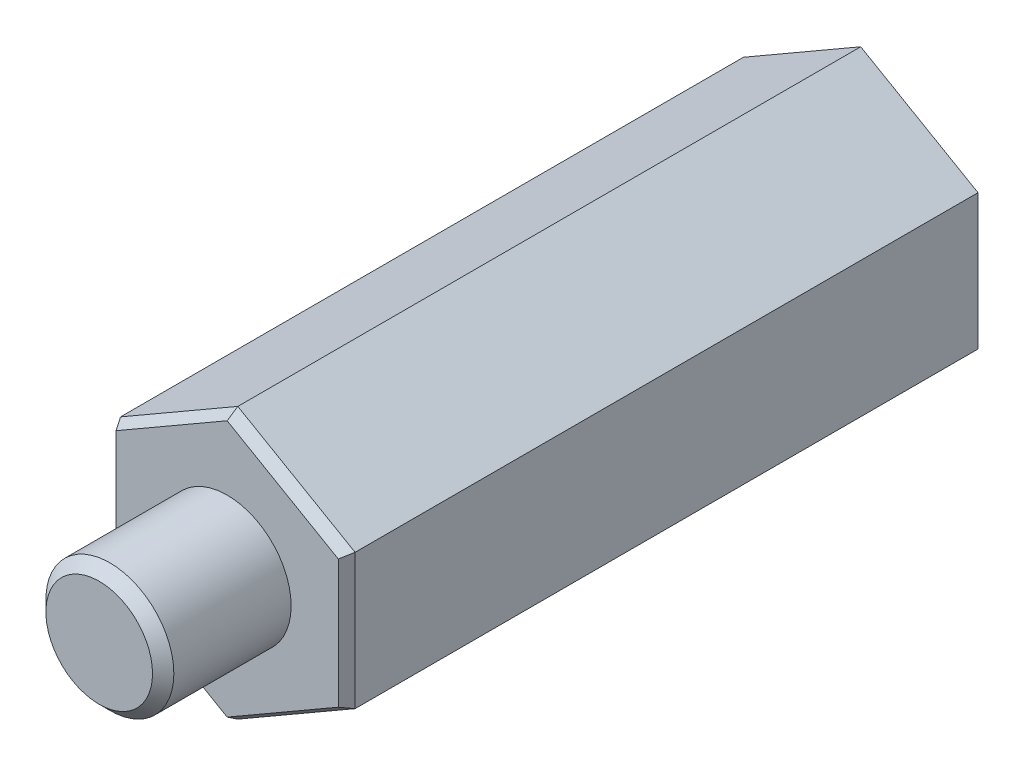
ISO-10303-21;
HEADER;
FILE_DESCRIPTION(('STEP AP214'),'2;1');
FILE_NAME('part.step','',(''),(''),'','','');
FILE_SCHEMA(('AUTOMOTIVE_DESIGN { 1 0 10303 214 1 1 1 1 }'));
ENDSEC;
DATA;
#1=APPLICATION_CONTEXT('core data for automotive mechanical design processes');
#2=APPLICATION_PROTOCOL_DEFINITION('international standard','automotive_design',2000,#1);
#3=PRODUCT_CONTEXT('',#1,'mechanical');
#4=PRODUCT('Part','Part','',(#3));
#5=PRODUCT_RELATED_PRODUCT_CATEGORY('part','',(#4));
#6=PRODUCT_DEFINITION_FORMATION('','',#4);
#7=PRODUCT_DEFINITION_CONTEXT('part definition',#1,'design');
#8=PRODUCT_DEFINITION('design','',#6,#7);
#9=PRODUCT_DEFINITION_SHAPE('','',#8);
#10=(LENGTH_UNIT() NAMED_UNIT(*) SI_UNIT(.MILLI.,.METRE.));
#11=(NAMED_UNIT(*) PLANE_ANGLE_UNIT() SI_UNIT($,.RADIAN.));
#12=(NAMED_UNIT(*) SI_UNIT($,.STERADIAN.) SOLID_ANGLE_UNIT());
#13=UNCERTAINTY_MEASURE_WITH_UNIT(LENGTH_MEASURE(1.E-05),#10,'distance_accuracy_value','');
#14=(GEOMETRIC_REPRESENTATION_CONTEXT(3) GLOBAL_UNCERTAINTY_ASSIGNED_CONTEXT((#13)) GLOBAL_UNIT_ASSIGNED_CONTEXT((#10,
#11,#12)) REPRESENTATION_CONTEXT('',''));
#15=CARTESIAN_POINT('',(0.,0.,0.));
#16=DIRECTION('',(0.,0.,1.));
#17=DIRECTION('',(1.,0.,0.));
#18=AXIS2_PLACEMENT_3D('',#15,#16,#17);
#19=CARTESIAN_POINT('',(0.,3.17542648054294,-15.));
#20=DIRECTION('',(-0.500000000000001,0.866025403784438,0.));
#21=DIRECTION('',(-0.866025403784438,-0.500000000000001,0.));
#22=AXIS2_PLACEMENT_3D('',#19,#20,#21);
#23=PLANE('',#22);
#24=DIRECTION('',(0.,0.,1.));
#25=VECTOR('',#24,1.);
#26=CARTESIAN_POINT('',(0.,3.17542648054294,-15.));
#27=LINE('',#26,#25);
#28=CARTESIAN_POINT('',(0.,3.17542648054294,-14.8556624327026));
#29=VERTEX_POINT('',#28);
#30=CARTESIAN_POINT('',(0.,3.17542648054294,-0.25));
#31=VERTEX_POINT('',#30);
#32=EDGE_CURVE('E185',#29,#31,#27,.T.);
#33=ORIENTED_EDGE('',*,*,#32,.F.);
#34=DIRECTION('',(-0.866025403784438,-0.500000000000001,0.));
#35=VECTOR('',#34,1.);
#36=CARTESIAN_POINT('',(-2.75,1.58771324027147,-14.8556624327026));
#37=LINE('',#36,#35);
#38=CARTESIAN_POINT('',(-2.75,1.58771324027147,-14.8556624327026));
#39=VERTEX_POINT('',#38);
#40=EDGE_CURVE('E214',#29,#39,#37,.T.);
#41=ORIENTED_EDGE('',*,*,#40,.T.);
#42=DIRECTION('',(0.,0.,1.));
#43=VECTOR('',#42,1.);
#44=CARTESIAN_POINT('',(-2.75,1.58771324027147,-15.));
#45=LINE('',#44,#43);
#46=CARTESIAN_POINT('',(-2.75,1.58771324027147,-0.25));
#47=VERTEX_POINT('',#46);
#48=EDGE_CURVE('E170',#39,#47,#45,.T.);
#49=ORIENTED_EDGE('',*,*,#48,.T.);
#50=DIRECTION('',(0.866025403784438,0.500000000000001,0.));
#51=VECTOR('',#50,1.);
#52=CARTESIAN_POINT('',(0.,3.17542648054294,-0.25));
#53=LINE('',#52,#51);
#54=EDGE_CURVE('E211',#47,#31,#53,.T.);
#55=ORIENTED_EDGE('',*,*,#54,.T.);
#56=EDGE_LOOP('',(#33,#41,#49,#55));
#57=FACE_BOUND('',#56,.T.);
#58=ADVANCED_FACE('F46',(#57),#23,.T.);
#59=CARTESIAN_POINT('',(2.75,1.58771324027147,-15.));
#60=DIRECTION('',(0.5,0.866025403784439,0.));
#61=DIRECTION('',(-0.866025403784439,0.5,0.));
#62=AXIS2_PLACEMENT_3D('',#59,#60,#61);
#63=PLANE('',#62);
#64=DIRECTION('',(0.,0.,1.));
#65=VECTOR('',#64,1.);
#66=CARTESIAN_POINT('',(2.75,1.58771324027147,-15.));
#67=LINE('',#66,#65);
#68=CARTESIAN_POINT('',(2.75,1.58771324027147,-14.8556624327026));
#69=VERTEX_POINT('',#68);
#70=CARTESIAN_POINT('',(2.75,1.58771324027147,-0.25));
#71=VERTEX_POINT('',#70);
#72=EDGE_CURVE('E190',#69,#71,#67,.T.);
#73=ORIENTED_EDGE('',*,*,#72,.F.);
#74=DIRECTION('',(-0.866025403784439,0.5,0.));
#75=VECTOR('',#74,1.);
#76=CARTESIAN_POINT('',(0.,3.17542648054294,-14.8556624327026));
#77=LINE('',#76,#75);
#78=EDGE_CURVE('E238',#69,#29,#77,.T.);
#79=ORIENTED_EDGE('',*,*,#78,.T.);
#80=ORIENTED_EDGE('',*,*,#32,.T.);
#81=DIRECTION('',(0.866025403784439,-0.5,0.));
#82=VECTOR('',#81,1.);
#83=CARTESIAN_POINT('',(2.75,1.58771324027147,-0.25));
#84=LINE('',#83,#82);
#85=EDGE_CURVE('E236',#31,#71,#84,.T.);
#86=ORIENTED_EDGE('',*,*,#85,.T.);
#87=EDGE_LOOP('',(#73,#79,#80,#86));
#88=FACE_BOUND('',#87,.T.);
#89=ADVANCED_FACE('F401',(#88),#63,.T.);
#90=CARTESIAN_POINT('',(2.75,-1.58771324027147,-15.));
#91=DIRECTION('',(1.,0.,0.));
#92=DIRECTION('',(0.,1.,0.));
#93=AXIS2_PLACEMENT_3D('',#90,#91,#92);
#94=PLANE('',#93);
#95=DIRECTION('',(0.,0.,1.));
#96=VECTOR('',#95,1.);
#97=CARTESIAN_POINT('',(2.75,-1.58771324027147,-15.));
#98=LINE('',#97,#96);
#99=CARTESIAN_POINT('',(2.75,-1.58771324027147,-14.8556624327026));
#100=VERTEX_POINT('',#99);
#101=CARTESIAN_POINT('',(2.75,-1.58771324027147,-0.25));
#102=VERTEX_POINT('',#101);
#103=EDGE_CURVE('E193',#100,#102,#98,.T.);
#104=ORIENTED_EDGE('',*,*,#103,.F.);
#105=DIRECTION('',(0.,1.,0.));
#106=VECTOR('',#105,1.);
#107=CARTESIAN_POINT('',(2.75,1.58771324027147,-14.8556624327026));
#108=LINE('',#107,#106);
#109=EDGE_CURVE('E245',#100,#69,#108,.T.);
#110=ORIENTED_EDGE('',*,*,#109,.T.);
#111=ORIENTED_EDGE('',*,*,#72,.T.);
#112=DIRECTION('',(0.,-1.,0.));
#113=VECTOR('',#112,1.);
#114=CARTESIAN_POINT('',(2.75,-1.58771324027147,-0.25));
#115=LINE('',#114,#113);
#116=EDGE_CURVE('E241',#71,#102,#115,.T.);
#117=ORIENTED_EDGE('',*,*,#116,.T.);
#118=EDGE_LOOP('',(#104,#110,#111,#117));
#119=FACE_BOUND('',#118,.T.);
#120=ADVANCED_FACE('F365',(#119),#94,.T.);
#121=CARTESIAN_POINT('',(0.,-3.17542648054294,-15.));
#122=DIRECTION('',(0.5,-0.866025403784438,0.));
#123=DIRECTION('',(0.866025403784438,0.5,0.));
#124=AXIS2_PLACEMENT_3D('',#121,#122,#123);
#125=PLANE('',#124);
#126=DIRECTION('',(0.,0.,1.));
#127=VECTOR('',#126,1.);
#128=CARTESIAN_POINT('',(0.,-3.17542648054294,-15.));
#129=LINE('',#128,#127);
#130=CARTESIAN_POINT('',(0.,-3.17542648054294,-14.8556624327026));
#131=VERTEX_POINT('',#130);
#132=CARTESIAN_POINT('',(0.,-3.17542648054294,-0.25));
#133=VERTEX_POINT('',#132);
#134=EDGE_CURVE('E197',#131,#133,#129,.T.);
#135=ORIENTED_EDGE('',*,*,#134,.F.);
#136=DIRECTION('',(0.866025403784438,0.5,0.));
#137=VECTOR('',#136,1.);
#138=CARTESIAN_POINT('',(2.75,-1.58771324027147,-14.8556624327026));
#139=LINE('',#138,#137);
#140=EDGE_CURVE('E251',#131,#100,#139,.T.);
#141=ORIENTED_EDGE('',*,*,#140,.T.);
#142=ORIENTED_EDGE('',*,*,#103,.T.);
#143=DIRECTION('',(-0.866025403784438,-0.5,0.));
#144=VECTOR('',#143,1.);
#145=CARTESIAN_POINT('',(0.,-3.17542648054294,-0.25));
#146=LINE('',#145,#144);
#147=EDGE_CURVE('E248',#102,#133,#146,.T.);
#148=ORIENTED_EDGE('',*,*,#147,.T.);
#149=EDGE_LOOP('',(#135,#141,#142,#148));
#150=FACE_BOUND('',#149,.T.);
#151=ADVANCED_FACE('F363',(#150),#125,.T.);
#152=CARTESIAN_POINT('',(-2.75,-1.58771324027147,-15.));
#153=DIRECTION('',(-0.5,-0.866025403784439,0.));
#154=DIRECTION('',(0.866025403784439,-0.5,0.));
#155=AXIS2_PLACEMENT_3D('',#152,#153,#154);
#156=PLANE('',#155);
#157=DIRECTION('',(0.,0.,1.));
#158=VECTOR('',#157,1.);
#159=CARTESIAN_POINT('',(-2.75,-1.58771324027147,-15.));
#160=LINE('',#159,#158);
#161=CARTESIAN_POINT('',(-2.75,-1.58771324027147,-14.8556624327026));
#162=VERTEX_POINT('',#161);
#163=CARTESIAN_POINT('',(-2.75,-1.58771324027147,-0.25));
#164=VERTEX_POINT('',#163);
#165=EDGE_CURVE('E177',#162,#164,#160,.T.);
#166=ORIENTED_EDGE('',*,*,#165,.F.);
#167=DIRECTION('',(0.866025403784439,-0.5,0.));
#168=VECTOR('',#167,1.);
#169=CARTESIAN_POINT('',(0.,-3.17542648054294,-14.8556624327026));
#170=LINE('',#169,#168);
#171=EDGE_CURVE('E257',#162,#131,#170,.T.);
#172=ORIENTED_EDGE('',*,*,#171,.T.);
#173=ORIENTED_EDGE('',*,*,#134,.T.);
#174=DIRECTION('',(-0.866025403784439,0.5,0.));
#175=VECTOR('',#174,1.);
#176=CARTESIAN_POINT('',(-2.75,-1.58771324027147,-0.25));
#177=LINE('',#176,#175);
#178=EDGE_CURVE('E254',#133,#164,#177,.T.);
#179=ORIENTED_EDGE('',*,*,#178,.T.);
#180=EDGE_LOOP('',(#166,#172,#173,#179));
#181=FACE_BOUND('',#180,.T.);
#182=ADVANCED_FACE('F349',(#181),#156,.T.);
#183=CARTESIAN_POINT('',(-2.75,1.58771324027147,-15.));
#184=DIRECTION('',(-1.,0.,0.));
#185=DIRECTION('',(0.,0.,1.));
#186=AXIS2_PLACEMENT_3D('',#183,#184,#185);
#187=PLANE('',#186);
#188=ORIENTED_EDGE('',*,*,#48,.F.);
#189=DIRECTION('',(0.,-1.,0.));
#190=VECTOR('',#189,1.);
#191=CARTESIAN_POINT('',(-2.75,-1.58771324027147,-14.8556624327026));
#192=LINE('',#191,#190);
#193=EDGE_CURVE('E263',#39,#162,#192,.T.);
#194=ORIENTED_EDGE('',*,*,#193,.T.);
#195=ORIENTED_EDGE('',*,*,#165,.T.);
#196=DIRECTION('',(0.,1.,0.));
#197=VECTOR('',#196,1.);
#198=CARTESIAN_POINT('',(-2.75,1.58771324027147,-0.25));
#199=LINE('',#198,#197);
#200=EDGE_CURVE('E260',#164,#47,#199,.T.);
#201=ORIENTED_EDGE('',*,*,#200,.T.);
#202=EDGE_LOOP('',(#188,#194,#195,#201));
#203=FACE_BOUND('',#202,.T.);
#204=ADVANCED_FACE('F331',(#203),#187,.T.);
#205=CARTESIAN_POINT('',(0.,0.,-15.));
#206=DIRECTION('',(0.,0.,1.));
#207=DIRECTION('',(1.,0.,0.));
#208=AXIS2_PLACEMENT_3D('',#205,#206,#207);
#209=PLANE('',#208);
#210=DIRECTION('',(0.,1.,0.));
#211=VECTOR('',#210,1.);
#212=CARTESIAN_POINT('',(-2.5,1.58771324027147,-15.));
#213=LINE('',#212,#211);
#214=CARTESIAN_POINT('',(-2.5,-1.44337567297406,-15.));
#215=VERTEX_POINT('',#214);
#216=CARTESIAN_POINT('',(-2.5,1.44337567297406,-15.));
#217=VERTEX_POINT('',#216);
#218=EDGE_CURVE('E218',#215,#217,#213,.T.);
#219=ORIENTED_EDGE('',*,*,#218,.T.);
#220=DIRECTION('',(0.866025403784438,0.500000000000001,0.));
#221=VECTOR('',#220,1.);
#222=CARTESIAN_POINT('',(0.125000000000002,2.95892012959683,-15.));
#223=LINE('',#222,#221);
#224=CARTESIAN_POINT('',(0.,2.88675134594813,-15.));
#225=VERTEX_POINT('',#224);
#226=EDGE_CURVE('E232',#217,#225,#223,.T.);
#227=ORIENTED_EDGE('',*,*,#226,.T.);
#228=DIRECTION('',(0.866025403784439,-0.5,0.));
#229=VECTOR('',#228,1.);
#230=CARTESIAN_POINT('',(2.625,1.37120688932536,-15.));
#231=LINE('',#230,#229);
#232=CARTESIAN_POINT('',(2.5,1.44337567297406,-15.));
#233=VERTEX_POINT('',#232);
#234=EDGE_CURVE('E229',#225,#233,#231,.T.);
#235=ORIENTED_EDGE('',*,*,#234,.T.);
#236=DIRECTION('',(0.,-1.,0.));
#237=VECTOR('',#236,1.);
#238=CARTESIAN_POINT('',(2.5,-1.58771324027147,-15.));
#239=LINE('',#238,#237);
#240=CARTESIAN_POINT('',(2.5,-1.44337567297406,-15.));
#241=VERTEX_POINT('',#240);
#242=EDGE_CURVE('E226',#233,#241,#239,.T.);
#243=ORIENTED_EDGE('',*,*,#242,.T.);
#244=DIRECTION('',(-0.866025403784439,-0.5,0.));
#245=VECTOR('',#244,1.);
#246=CARTESIAN_POINT('',(-0.125000000000002,-2.95892012959683,-15.));
#247=LINE('',#246,#245);
#248=CARTESIAN_POINT('',(0.,-2.88675134594813,-15.));
#249=VERTEX_POINT('',#248);
#250=EDGE_CURVE('E223',#241,#249,#247,.T.);
#251=ORIENTED_EDGE('',*,*,#250,.T.);
#252=DIRECTION('',(-0.866025403784439,0.5,0.));
#253=VECTOR('',#252,1.);
#254=CARTESIAN_POINT('',(-2.625,-1.37120688932536,-15.));
#255=LINE('',#254,#253);
#256=EDGE_CURVE('E220',#249,#215,#255,.T.);
#257=ORIENTED_EDGE('',*,*,#256,.T.);
#258=EDGE_LOOP('',(#219,#227,#235,#243,#251,#257));
#259=FACE_BOUND('',#258,.T.);
#260=CARTESIAN_POINT('',(0.,0.,-15.));
#261=DIRECTION('',(0.,0.,-1.));
#262=DIRECTION('',(-1.,0.,0.));
#263=AXIS2_PLACEMENT_3D('',#260,#261,#262);
#264=CIRCLE('',#263,1.525);
#265=CARTESIAN_POINT('',(-1.525,0.,-15.));
#266=VERTEX_POINT('',#265);
#267=EDGE_CURVE('E181',#266,#266,#264,.T.);
#268=ORIENTED_EDGE('',*,*,#267,.F.);
#269=EDGE_LOOP('',(#268));
#270=FACE_BOUND('',#269,.T.);
#271=ADVANCED_FACE('F380',(#259,#270),#209,.F.);
#272=CARTESIAN_POINT('',(0.,0.,0.));
#273=DIRECTION('',(0.,0.,1.));
#274=DIRECTION('',(1.,0.,0.));
#275=AXIS2_PLACEMENT_3D('',#272,#273,#274);
#276=PLANE('',#275);
#277=DIRECTION('',(0.866025403784439,0.5,0.));
#278=VECTOR('',#277,1.);
#279=CARTESIAN_POINT('',(1.3028312163513,-2.25656986040721,0.));
#280=LINE('',#279,#278);
#281=CARTESIAN_POINT('',(0.,-3.00875981387628,0.));
#282=VERTEX_POINT('',#281);
#283=CARTESIAN_POINT('',(2.60566243270259,-1.50437990693814,0.));
#284=VERTEX_POINT('',#283);
#285=EDGE_CURVE('E56',#282,#284,#280,.T.);
#286=ORIENTED_EDGE('',*,*,#285,.T.);
#287=DIRECTION('',(0.,1.,0.));
#288=VECTOR('',#287,1.);
#289=CARTESIAN_POINT('',(2.60566243270259,0.,0.));
#290=LINE('',#289,#288);
#291=CARTESIAN_POINT('',(2.60566243270259,1.50437990693814,0.));
#292=VERTEX_POINT('',#291);
#293=EDGE_CURVE('E11',#284,#292,#290,.T.);
#294=ORIENTED_EDGE('',*,*,#293,.T.);
#295=DIRECTION('',(-0.866025403784439,0.5,0.));
#296=VECTOR('',#295,1.);
#297=CARTESIAN_POINT('',(1.3028312163513,2.25656986040721,0.));
#298=LINE('',#297,#296);
#299=CARTESIAN_POINT('',(0.,3.00875981387628,0.));
#300=VERTEX_POINT('',#299);
#301=EDGE_CURVE('E266',#292,#300,#298,.T.);
#302=ORIENTED_EDGE('',*,*,#301,.T.);
#303=DIRECTION('',(-0.866025403784438,-0.500000000000001,0.));
#304=VECTOR('',#303,1.);
#305=CARTESIAN_POINT('',(-1.3028312163513,2.25656986040721,0.));
#306=LINE('',#305,#304);
#307=CARTESIAN_POINT('',(-2.60566243270259,1.50437990693814,0.));
#308=VERTEX_POINT('',#307);
#309=EDGE_CURVE('E269',#300,#308,#306,.T.);
#310=ORIENTED_EDGE('',*,*,#309,.T.);
#311=DIRECTION('',(0.,-1.,0.));
#312=VECTOR('',#311,1.);
#313=CARTESIAN_POINT('',(-2.60566243270259,0.,0.));
#314=LINE('',#313,#312);
#315=CARTESIAN_POINT('',(-2.60566243270259,-1.50437990693814,0.));
#316=VERTEX_POINT('',#315);
#317=EDGE_CURVE('E272',#308,#316,#314,.T.);
#318=ORIENTED_EDGE('',*,*,#317,.T.);
#319=DIRECTION('',(0.866025403784439,-0.5,0.));
#320=VECTOR('',#319,1.);
#321=CARTESIAN_POINT('',(-1.3028312163513,-2.25656986040721,0.));
#322=LINE('',#321,#320);
#323=EDGE_CURVE('E73',#316,#282,#322,.T.);
#324=ORIENTED_EDGE('',*,*,#323,.T.);
#325=EDGE_LOOP('',(#286,#294,#302,#310,#318,#324));
#326=FACE_BOUND('',#325,.T.);
#327=CARTESIAN_POINT('',(0.,0.,0.));
#328=DIRECTION('',(0.,0.,1.));
#329=DIRECTION('',(1.,0.,0.));
#330=AXIS2_PLACEMENT_3D('',#327,#328,#329);
#331=CIRCLE('',#330,1.5);
#332=CARTESIAN_POINT('',(1.5,0.,0.));
#333=VERTEX_POINT('',#332);
#334=EDGE_CURVE('E299',#333,#333,#331,.T.);
#335=ORIENTED_EDGE('',*,*,#334,.F.);
#336=EDGE_LOOP('',(#335));
#337=FACE_BOUND('',#336,.T.);
#338=ADVANCED_FACE('F163',(#326,#337),#276,.T.);
#339=CARTESIAN_POINT('',(0.,0.,-7.));
#340=DIRECTION('',(0.,0.,-1.));
#341=DIRECTION('',(-1.,0.,0.));
#342=AXIS2_PLACEMENT_3D('',#339,#340,#341);
#343=CONICAL_SURFACE('',#342,1.25,1.02974425867665);
#344=CARTESIAN_POINT('',(0.,0.,-6.24892422621555));
#345=VERTEX_POINT('',#344);
#346=VERTEX_LOOP('',#345);
#347=FACE_BOUND('',#346,.T.);
#348=CARTESIAN_POINT('',(0.,0.,-7.));
#349=DIRECTION('',(0.,0.,-1.));
#350=DIRECTION('',(-1.,0.,0.));
#351=AXIS2_PLACEMENT_3D('',#348,#349,#350);
#352=CIRCLE('',#351,1.25);
#353=CARTESIAN_POINT('',(-1.25,0.,-7.));
#354=VERTEX_POINT('',#353);
#355=EDGE_CURVE('E167',#354,#354,#352,.T.);
#356=ORIENTED_EDGE('',*,*,#355,.T.);
#357=EDGE_LOOP('',(#356));
#358=FACE_BOUND('',#357,.T.);
#359=ADVANCED_FACE('F159',(#347,#358),#343,.F.);
#360=CARTESIAN_POINT('',(0.,0.,-15.));
#361=DIRECTION('',(0.,0.,-1.));
#362=DIRECTION('',(-1.,0.,0.));
#363=AXIS2_PLACEMENT_3D('',#360,#361,#362);
#364=CYLINDRICAL_SURFACE('',#363,1.25);
#365=ORIENTED_EDGE('',*,*,#355,.F.);
#366=EDGE_LOOP('',(#365));
#367=FACE_BOUND('',#366,.T.);
#368=CARTESIAN_POINT('',(0.,0.,-14.725));
#369=DIRECTION('',(0.,0.,-1.));
#370=DIRECTION('',(-1.,0.,0.));
#371=AXIS2_PLACEMENT_3D('',#368,#369,#370);
#372=CIRCLE('',#371,1.25);
#373=CARTESIAN_POINT('',(-1.25,0.,-14.725));
#374=VERTEX_POINT('',#373);
#375=EDGE_CURVE('E171',#374,#374,#372,.T.);
#376=ORIENTED_EDGE('',*,*,#375,.T.);
#377=EDGE_LOOP('',(#376));
#378=FACE_BOUND('',#377,.T.);
#379=ADVANCED_FACE('F162',(#367,#378),#364,.F.);
#380=CARTESIAN_POINT('',(0.,0.,-15.));
#381=DIRECTION('',(0.,0.,-1.));
#382=DIRECTION('',(-1.,0.,0.));
#383=AXIS2_PLACEMENT_3D('',#380,#381,#382);
#384=CONICAL_SURFACE('',#383,1.525,0.785398163397446);
#385=ORIENTED_EDGE('',*,*,#375,.F.);
#386=EDGE_LOOP('',(#385));
#387=FACE_BOUND('',#386,.T.);
#388=ORIENTED_EDGE('',*,*,#267,.T.);
#389=EDGE_LOOP('',(#388));
#390=FACE_BOUND('',#389,.T.);
#391=ADVANCED_FACE('F391',(#387,#390),#384,.F.);
#392=CARTESIAN_POINT('',(0.,0.,3.));
#393=DIRECTION('',(0.,0.,-1.));
#394=DIRECTION('',(-1.,0.,0.));
#395=AXIS2_PLACEMENT_3D('',#392,#393,#394);
#396=CYLINDRICAL_SURFACE('',#395,1.5);
#397=CARTESIAN_POINT('',(0.,0.,2.75));
#398=DIRECTION('',(0.,0.,1.));
#399=DIRECTION('',(1.,0.,0.));
#400=AXIS2_PLACEMENT_3D('',#397,#398,#399);
#401=CIRCLE('',#400,1.5);
#402=CARTESIAN_POINT('',(1.5,0.,2.75));
#403=VERTEX_POINT('',#402);
#404=EDGE_CURVE('E207',#403,#403,#401,.F.);
#405=ORIENTED_EDGE('',*,*,#404,.T.);
#406=EDGE_LOOP('',(#405));
#407=FACE_BOUND('',#406,.T.);
#408=ORIENTED_EDGE('',*,*,#334,.T.);
#409=EDGE_LOOP('',(#408));
#410=FACE_BOUND('',#409,.T.);
#411=ADVANCED_FACE('F483',(#407,#410),#396,.T.);
#412=CARTESIAN_POINT('',(0.,0.,3.));
#413=DIRECTION('',(0.,0.,1.));
#414=DIRECTION('',(1.,0.,0.));
#415=AXIS2_PLACEMENT_3D('',#412,#413,#414);
#416=PLANE('',#415);
#417=CARTESIAN_POINT('',(0.,0.,3.));
#418=DIRECTION('',(0.,0.,1.));
#419=DIRECTION('',(1.,0.,0.));
#420=AXIS2_PLACEMENT_3D('',#417,#418,#419);
#421=CIRCLE('',#420,1.25);
#422=CARTESIAN_POINT('',(1.25,0.,3.));
#423=VERTEX_POINT('',#422);
#424=EDGE_CURVE('E189',#423,#423,#421,.T.);
#425=ORIENTED_EDGE('',*,*,#424,.T.);
#426=EDGE_LOOP('',(#425));
#427=FACE_BOUND('',#426,.T.);
#428=ADVANCED_FACE('F413',(#427),#416,.T.);
#429=CARTESIAN_POINT('',(0.,0.,3.));
#430=DIRECTION('',(0.,0.,-1.));
#431=DIRECTION('',(-1.,0.,0.));
#432=AXIS2_PLACEMENT_3D('',#429,#430,#431);
#433=CONICAL_SURFACE('',#432,1.25,0.785398163397448);
#434=ORIENTED_EDGE('',*,*,#404,.F.);
#435=EDGE_LOOP('',(#434));
#436=FACE_BOUND('',#435,.T.);
#437=ORIENTED_EDGE('',*,*,#424,.F.);
#438=EDGE_LOOP('',(#437));
#439=FACE_BOUND('',#438,.T.);
#440=ADVANCED_FACE('F410',(#436,#439),#433,.T.);
#441=CARTESIAN_POINT('',(0.,-3.17542648054294,-14.8556624327026));
#442=DIRECTION('',(0.249999999999998,-0.433012701892215,-0.866025403784442));
#443=DIRECTION('',(-0.866025403784438,-0.5,0.));
#444=AXIS2_PLACEMENT_3D('',#441,#442,#443);
#445=PLANE('',#444);
#446=DIRECTION('',(0.,-0.894427190999918,0.447213595499953));
#447=VECTOR('',#446,1.);
#448=CARTESIAN_POINT('',(0.,-1.90525588832576,-15.4907477288112));
#449=LINE('',#448,#447);
#450=EDGE_CURVE('E291',#249,#131,#449,.T.);
#451=ORIENTED_EDGE('',*,*,#450,.F.);
#452=ORIENTED_EDGE('',*,*,#250,.F.);
#453=DIRECTION('',(0.774596669241486,-0.447213595499959,0.447213595499953));
#454=VECTOR('',#453,1.);
#455=CARTESIAN_POINT('',(1.64999999999999,-0.952627944162878,-15.4907477288112));
#456=LINE('',#455,#454);
#457=EDGE_CURVE('E295',#100,#241,#456,.F.);
#458=ORIENTED_EDGE('',*,*,#457,.F.);
#459=ORIENTED_EDGE('',*,*,#140,.F.);
#460=EDGE_LOOP('',(#451,#452,#458,#459));
#461=FACE_BOUND('',#460,.T.);
#462=ADVANCED_FACE('F358',(#461),#445,.T.);
#463=CARTESIAN_POINT('',(2.75,-1.58771324027147,-14.8556624327026));
#464=DIRECTION('',(0.499999999999995,0.,-0.866025403784442));
#465=DIRECTION('',(0.,-1.,0.));
#466=AXIS2_PLACEMENT_3D('',#463,#464,#465);
#467=PLANE('',#466);
#468=ORIENTED_EDGE('',*,*,#457,.T.);
#469=ORIENTED_EDGE('',*,*,#242,.F.);
#470=DIRECTION('',(0.774596669241485,0.447213595499959,0.447213595499953));
#471=VECTOR('',#470,1.);
#472=CARTESIAN_POINT('',(1.64999999999999,0.95262794416288,-15.4907477288112));
#473=LINE('',#472,#471);
#474=EDGE_CURVE('E287',#69,#233,#473,.F.);
#475=ORIENTED_EDGE('',*,*,#474,.F.);
#476=ORIENTED_EDGE('',*,*,#109,.F.);
#477=EDGE_LOOP('',(#468,#469,#475,#476));
#478=FACE_BOUND('',#477,.T.);
#479=ADVANCED_FACE('F425',(#478),#467,.T.);
#480=CARTESIAN_POINT('',(-2.75,-1.58771324027147,-14.8556624327026));
#481=DIRECTION('',(-0.249999999999997,-0.433012701892215,-0.866025403784442));
#482=DIRECTION('',(-0.866025403784439,0.5,0.));
#483=AXIS2_PLACEMENT_3D('',#480,#481,#482);
#484=PLANE('',#483);
#485=ORIENTED_EDGE('',*,*,#450,.T.);
#486=ORIENTED_EDGE('',*,*,#171,.F.);
#487=DIRECTION('',(-0.774596669241485,-0.447213595499959,0.447213595499953));
#488=VECTOR('',#487,1.);
#489=CARTESIAN_POINT('',(-1.64999999999999,-0.952627944162879,-15.4907477288112));
#490=LINE('',#489,#488);
#491=EDGE_CURVE('E284',#215,#162,#490,.T.);
#492=ORIENTED_EDGE('',*,*,#491,.F.);
#493=ORIENTED_EDGE('',*,*,#256,.F.);
#494=EDGE_LOOP('',(#485,#486,#492,#493));
#495=FACE_BOUND('',#494,.T.);
#496=ADVANCED_FACE('F352',(#495),#484,.T.);
#497=CARTESIAN_POINT('',(2.75,1.58771324027147,-14.8556624327026));
#498=DIRECTION('',(0.249999999999997,0.433012701892215,-0.866025403784442));
#499=DIRECTION('',(0.866025403784439,-0.5,0.));
#500=AXIS2_PLACEMENT_3D('',#497,#498,#499);
#501=PLANE('',#500);
#502=ORIENTED_EDGE('',*,*,#474,.T.);
#503=ORIENTED_EDGE('',*,*,#234,.F.);
#504=DIRECTION('',(0.,0.894427190999918,0.447213595499953));
#505=VECTOR('',#504,1.);
#506=CARTESIAN_POINT('',(0.,1.90525588832576,-15.4907477288112));
#507=LINE('',#506,#505);
#508=EDGE_CURVE('E281',#29,#225,#507,.F.);
#509=ORIENTED_EDGE('',*,*,#508,.F.);
#510=ORIENTED_EDGE('',*,*,#78,.F.);
#511=EDGE_LOOP('',(#502,#503,#509,#510));
#512=FACE_BOUND('',#511,.T.);
#513=ADVANCED_FACE('F419',(#512),#501,.T.);
#514=CARTESIAN_POINT('',(-2.75,1.58771324027147,-14.8556624327026));
#515=DIRECTION('',(-0.499999999999995,0.,-0.866025403784442));
#516=DIRECTION('',(0.,1.,0.));
#517=AXIS2_PLACEMENT_3D('',#514,#515,#516);
#518=PLANE('',#517);
#519=ORIENTED_EDGE('',*,*,#491,.T.);
#520=ORIENTED_EDGE('',*,*,#193,.F.);
#521=DIRECTION('',(0.774596669241485,-0.447213595499959,-0.447213595499953));
#522=VECTOR('',#521,1.);
#523=CARTESIAN_POINT('',(-2.75,1.58771324027147,-14.8556624327026));
#524=LINE('',#523,#522);
#525=EDGE_CURVE('E279',#217,#39,#524,.F.);
#526=ORIENTED_EDGE('',*,*,#525,.F.);
#527=ORIENTED_EDGE('',*,*,#218,.F.);
#528=EDGE_LOOP('',(#519,#520,#526,#527));
#529=FACE_BOUND('',#528,.T.);
#530=ADVANCED_FACE('F345',(#529),#518,.T.);
#531=CARTESIAN_POINT('',(0.,3.17542648054294,-14.8556624327026));
#532=DIRECTION('',(-0.249999999999998,0.433012701892214,-0.866025403784442));
#533=DIRECTION('',(0.866025403784438,0.500000000000001,0.));
#534=AXIS2_PLACEMENT_3D('',#531,#532,#533);
#535=PLANE('',#534);
#536=ORIENTED_EDGE('',*,*,#508,.T.);
#537=ORIENTED_EDGE('',*,*,#226,.F.);
#538=ORIENTED_EDGE('',*,*,#525,.T.);
#539=ORIENTED_EDGE('',*,*,#40,.F.);
#540=EDGE_LOOP('',(#536,#537,#538,#539));
#541=FACE_BOUND('',#540,.T.);
#542=ADVANCED_FACE('F338',(#541),#535,.T.);
#543=CARTESIAN_POINT('',(-2.60566243270259,0.,0.));
#544=DIRECTION('',(0.866025403784439,0.,-0.5));
#545=DIRECTION('',(0.,-1.,0.));
#546=AXIS2_PLACEMENT_3D('',#543,#544,#545);
#547=PLANE('',#546);
#548=DIRECTION('',(0.480384461415262,-0.277350098112612,0.832050294337844));
#549=VECTOR('',#548,1.);
#550=CARTESIAN_POINT('',(-2.40522686095624,1.3886583756352,0.347164593908803));
#551=LINE('',#550,#549);
#552=EDGE_CURVE('E313',#47,#308,#551,.T.);
#553=ORIENTED_EDGE('',*,*,#552,.F.);
#554=ORIENTED_EDGE('',*,*,#200,.F.);
#555=DIRECTION('',(0.480384461415262,0.277350098112613,0.832050294337844));
#556=VECTOR('',#555,1.);
#557=CARTESIAN_POINT('',(-2.40522686095624,-1.38865837563521,0.3471645939088));
#558=LINE('',#557,#556);
#559=EDGE_CURVE('E50',#316,#164,#558,.F.);
#560=ORIENTED_EDGE('',*,*,#559,.F.);
#561=ORIENTED_EDGE('',*,*,#317,.F.);
#562=EDGE_LOOP('',(#553,#554,#560,#561));
#563=FACE_BOUND('',#562,.T.);
#564=ADVANCED_FACE('F48',(#563),#547,.F.);
#565=CARTESIAN_POINT('',(-1.3028312163513,-2.25656986040721,0.));
#566=DIRECTION('',(0.43301270189222,0.75,-0.499999999999999));
#567=DIRECTION('',(0.866025403784439,-0.5,0.));
#568=AXIS2_PLACEMENT_3D('',#565,#566,#567);
#569=PLANE('',#568);
#570=ORIENTED_EDGE('',*,*,#559,.T.);
#571=ORIENTED_EDGE('',*,*,#178,.F.);
#572=DIRECTION('',(0.,0.554700196225229,0.832050294337844));
#573=VECTOR('',#572,1.);
#574=CARTESIAN_POINT('',(0.,-2.77731675127041,0.347164593908802));
#575=LINE('',#574,#573);
#576=EDGE_CURVE('E310',#282,#133,#575,.F.);
#577=ORIENTED_EDGE('',*,*,#576,.F.);
#578=ORIENTED_EDGE('',*,*,#323,.F.);
#579=EDGE_LOOP('',(#570,#571,#577,#578));
#580=FACE_BOUND('',#579,.T.);
#581=ADVANCED_FACE('F325',(#580),#569,.F.);
#582=CARTESIAN_POINT('',(-1.3028312163513,2.25656986040721,0.));
#583=DIRECTION('',(0.43301270189222,-0.750000000000001,-0.499999999999998));
#584=DIRECTION('',(-0.866025403784438,-0.500000000000001,0.));
#585=AXIS2_PLACEMENT_3D('',#582,#583,#584);
#586=PLANE('',#585);
#587=ORIENTED_EDGE('',*,*,#552,.T.);
#588=ORIENTED_EDGE('',*,*,#309,.F.);
#589=DIRECTION('',(0.,-0.554700196225228,0.832050294337844));
#590=VECTOR('',#589,1.);
#591=CARTESIAN_POINT('',(0.,2.77731675127041,0.347164593908798));
#592=LINE('',#591,#590);
#593=EDGE_CURVE('E306',#31,#300,#592,.T.);
#594=ORIENTED_EDGE('',*,*,#593,.F.);
#595=ORIENTED_EDGE('',*,*,#54,.F.);
#596=EDGE_LOOP('',(#587,#588,#594,#595));
#597=FACE_BOUND('',#596,.T.);
#598=ADVANCED_FACE('F438',(#597),#586,.F.);
#599=CARTESIAN_POINT('',(1.3028312163513,-2.25656986040721,0.));
#600=DIRECTION('',(-0.43301270189222,0.75,-0.5));
#601=DIRECTION('',(0.866025403784438,0.5,0.));
#602=AXIS2_PLACEMENT_3D('',#599,#600,#601);
#603=PLANE('',#602);
#604=ORIENTED_EDGE('',*,*,#576,.T.);
#605=ORIENTED_EDGE('',*,*,#147,.F.);
#606=DIRECTION('',(-0.48038446141526,0.277350098112615,0.832050294337844));
#607=VECTOR('',#606,1.);
#608=CARTESIAN_POINT('',(2.40522686095624,-1.3886583756352,0.347164593908799));
#609=LINE('',#608,#607);
#610=EDGE_CURVE('E303',#284,#102,#609,.F.);
#611=ORIENTED_EDGE('',*,*,#610,.F.);
#612=ORIENTED_EDGE('',*,*,#285,.F.);
#613=EDGE_LOOP('',(#604,#605,#611,#612));
#614=FACE_BOUND('',#613,.T.);
#615=ADVANCED_FACE('F435',(#614),#603,.F.);
#616=CARTESIAN_POINT('',(1.3028312163513,2.25656986040721,0.));
#617=DIRECTION('',(-0.433012701892219,-0.75,-0.5));
#618=DIRECTION('',(-0.866025403784439,0.5,0.));
#619=AXIS2_PLACEMENT_3D('',#616,#617,#618);
#620=PLANE('',#619);
#621=ORIENTED_EDGE('',*,*,#593,.T.);
#622=ORIENTED_EDGE('',*,*,#301,.F.);
#623=DIRECTION('',(0.48038446141526,0.277350098112616,-0.832050294337844));
#624=VECTOR('',#623,1.);
#625=CARTESIAN_POINT('',(2.40522686095624,1.3886583756352,0.347164593908799));
#626=LINE('',#625,#624);
#627=EDGE_CURVE('E300',#71,#292,#626,.F.);
#628=ORIENTED_EDGE('',*,*,#627,.F.);
#629=ORIENTED_EDGE('',*,*,#85,.F.);
#630=EDGE_LOOP('',(#621,#622,#628,#629));
#631=FACE_BOUND('',#630,.T.);
#632=ADVANCED_FACE('F376',(#631),#620,.F.);
#633=CARTESIAN_POINT('',(2.60566243270259,0.,0.));
#634=DIRECTION('',(-0.866025403784439,0.,-0.499999999999999));
#635=DIRECTION('',(0.,1.,0.));
#636=AXIS2_PLACEMENT_3D('',#633,#634,#635);
#637=PLANE('',#636);
#638=ORIENTED_EDGE('',*,*,#610,.T.);
#639=ORIENTED_EDGE('',*,*,#116,.F.);
#640=ORIENTED_EDGE('',*,*,#627,.T.);
#641=ORIENTED_EDGE('',*,*,#293,.F.);
#642=EDGE_LOOP('',(#638,#639,#640,#641));
#643=FACE_BOUND('',#642,.T.);
#644=ADVANCED_FACE('F370',(#643),#637,.F.);
#645=CLOSED_SHELL('',(#58,#89,#120,#151,#182,#204,#271,#338,#359,#379,#391,#411,#428,#440,#462,
#479,#496,#513,#530,#542,#564,#581,#598,#615,#632,#644));
#646=MANIFOLD_SOLID_BREP('B2',#645);
#647=ADVANCED_BREP_SHAPE_REPRESENTATION('',(#18,#646),#14);
#648=SHAPE_DEFINITION_REPRESENTATION(#9,#647);
ENDSEC;
END-ISO-10303-21;
